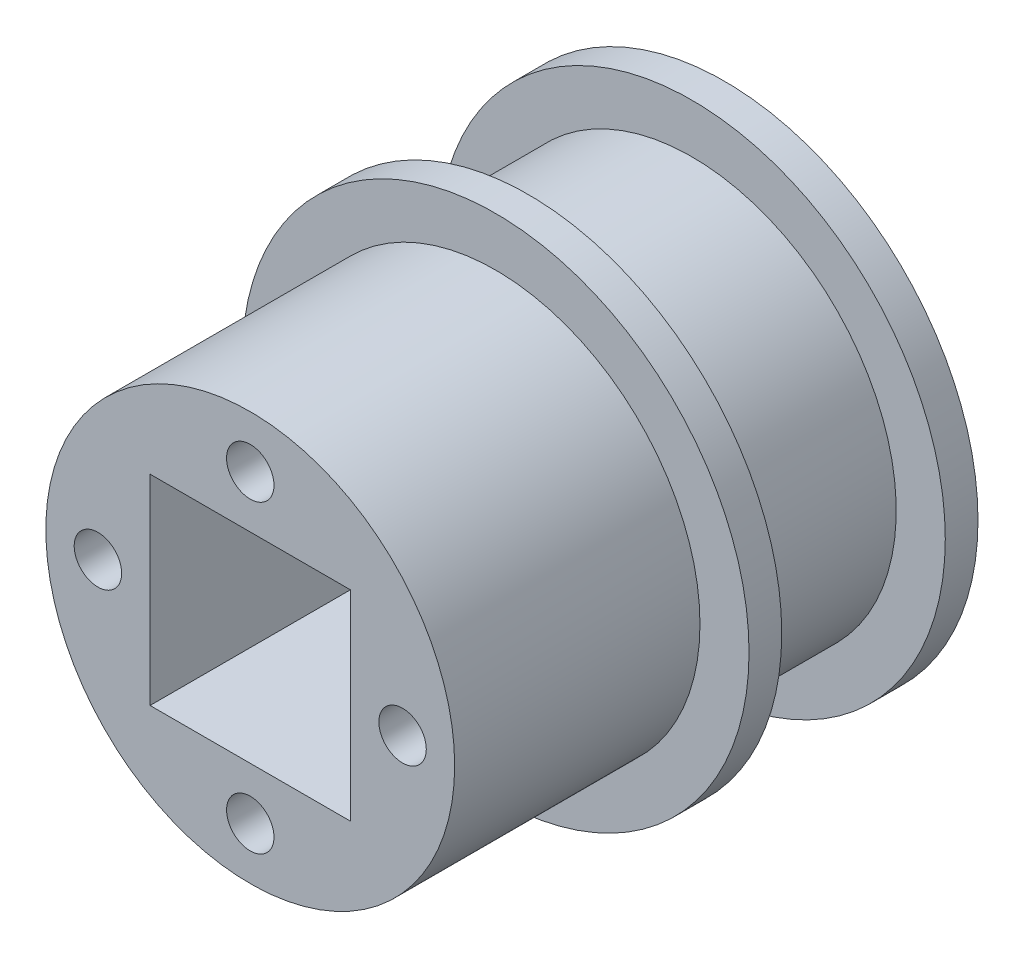
ISO-10303-21;
HEADER;
FILE_DESCRIPTION(('STEP AP214'),'2;1');
FILE_NAME('part.step','',(''),(''),'','','');
FILE_SCHEMA(('AUTOMOTIVE_DESIGN { 1 0 10303 214 1 1 1 1 }'));
ENDSEC;
DATA;
#1=APPLICATION_CONTEXT('core data for automotive mechanical design processes');
#2=APPLICATION_PROTOCOL_DEFINITION('international standard','automotive_design',2000,#1);
#3=PRODUCT_CONTEXT('',#1,'mechanical');
#4=PRODUCT('Part','Part','',(#3));
#5=PRODUCT_RELATED_PRODUCT_CATEGORY('part','',(#4));
#6=PRODUCT_DEFINITION_FORMATION('','',#4);
#7=PRODUCT_DEFINITION_CONTEXT('part definition',#1,'design');
#8=PRODUCT_DEFINITION('design','',#6,#7);
#9=PRODUCT_DEFINITION_SHAPE('','',#8);
#10=(LENGTH_UNIT() NAMED_UNIT(*) SI_UNIT(.MILLI.,.METRE.));
#11=(NAMED_UNIT(*) PLANE_ANGLE_UNIT() SI_UNIT($,.RADIAN.));
#12=(NAMED_UNIT(*) SI_UNIT($,.STERADIAN.) SOLID_ANGLE_UNIT());
#13=UNCERTAINTY_MEASURE_WITH_UNIT(LENGTH_MEASURE(1.E-05),#10,'distance_accuracy_value','');
#14=(GEOMETRIC_REPRESENTATION_CONTEXT(3) GLOBAL_UNCERTAINTY_ASSIGNED_CONTEXT((#13)) GLOBAL_UNIT_ASSIGNED_CONTEXT((#10,
#11,#12)) REPRESENTATION_CONTEXT('',''));
#15=CARTESIAN_POINT('',(0.,0.,0.));
#16=DIRECTION('',(0.,0.,1.));
#17=DIRECTION('',(1.,0.,0.));
#18=AXIS2_PLACEMENT_3D('',#15,#16,#17);
#19=CARTESIAN_POINT('',(0.,0.,7.5));
#20=DIRECTION('',(0.,0.,-1.));
#21=DIRECTION('',(-1.,0.,0.));
#22=AXIS2_PLACEMENT_3D('',#19,#20,#21);
#23=CYLINDRICAL_SURFACE('',#22,12.5);
#24=CARTESIAN_POINT('',(0.,0.,7.5));
#25=DIRECTION('',(0.,0.,1.));
#26=DIRECTION('',(1.,0.,0.));
#27=AXIS2_PLACEMENT_3D('',#24,#25,#26);
#28=CIRCLE('',#27,12.5);
#29=CARTESIAN_POINT('',(12.5,0.,7.5));
#30=VERTEX_POINT('',#29);
#31=EDGE_CURVE('E48',#30,#30,#28,.T.);
#32=ORIENTED_EDGE('',*,*,#31,.F.);
#33=EDGE_LOOP('',(#32));
#34=FACE_BOUND('',#33,.T.);
#35=CARTESIAN_POINT('',(0.,0.,-7.5));
#36=DIRECTION('',(0.,0.,1.));
#37=DIRECTION('',(1.,0.,0.));
#38=AXIS2_PLACEMENT_3D('',#35,#36,#37);
#39=CIRCLE('',#38,12.5);
#40=CARTESIAN_POINT('',(12.5,0.,-7.5));
#41=VERTEX_POINT('',#40);
#42=EDGE_CURVE('E42',#41,#41,#39,.T.);
#43=ORIENTED_EDGE('',*,*,#42,.T.);
#44=EDGE_LOOP('',(#43));
#45=FACE_BOUND('',#44,.T.);
#46=ADVANCED_FACE('F39',(#34,#45),#23,.T.);
#47=CARTESIAN_POINT('',(0.,0.,7.5));
#48=DIRECTION('',(0.,0.,1.));
#49=DIRECTION('',(1.,0.,0.));
#50=AXIS2_PLACEMENT_3D('',#47,#48,#49);
#51=PLANE('',#50);
#52=CARTESIAN_POINT('',(9.315,0.,7.5));
#53=DIRECTION('',(0.,0.,1.));
#54=DIRECTION('',(1.,0.,0.));
#55=AXIS2_PLACEMENT_3D('',#52,#53,#54);
#56=CIRCLE('',#55,1.45);
#57=CARTESIAN_POINT('',(10.765,0.,7.5));
#58=VERTEX_POINT('',#57);
#59=EDGE_CURVE('E333',#58,#58,#56,.T.);
#60=ORIENTED_EDGE('',*,*,#59,.F.);
#61=EDGE_LOOP('',(#60));
#62=FACE_BOUND('',#61,.T.);
#63=CARTESIAN_POINT('',(0.,-9.315,7.5));
#64=DIRECTION('',(0.,0.,1.));
#65=DIRECTION('',(1.,0.,0.));
#66=AXIS2_PLACEMENT_3D('',#63,#64,#65);
#67=CIRCLE('',#66,1.45);
#68=CARTESIAN_POINT('',(1.44999999999997,-9.315,7.5));
#69=VERTEX_POINT('',#68);
#70=EDGE_CURVE('E359',#69,#69,#67,.T.);
#71=ORIENTED_EDGE('',*,*,#70,.F.);
#72=EDGE_LOOP('',(#71));
#73=FACE_BOUND('',#72,.T.);
#74=CARTESIAN_POINT('',(-9.315,0.,7.5));
#75=DIRECTION('',(0.,0.,1.));
#76=DIRECTION('',(1.,0.,0.));
#77=AXIS2_PLACEMENT_3D('',#74,#75,#76);
#78=CIRCLE('',#77,1.45);
#79=CARTESIAN_POINT('',(-7.865,0.,7.5));
#80=VERTEX_POINT('',#79);
#81=EDGE_CURVE('E351',#80,#80,#78,.T.);
#82=ORIENTED_EDGE('',*,*,#81,.F.);
#83=EDGE_LOOP('',(#82));
#84=FACE_BOUND('',#83,.T.);
#85=CARTESIAN_POINT('',(0.,9.315,7.5));
#86=DIRECTION('',(0.,0.,1.));
#87=DIRECTION('',(1.,0.,0.));
#88=AXIS2_PLACEMENT_3D('',#85,#86,#87);
#89=CIRCLE('',#88,1.45);
#90=CARTESIAN_POINT('',(1.4500000000001,9.315,7.5));
#91=VERTEX_POINT('',#90);
#92=EDGE_CURVE('E343',#91,#91,#89,.T.);
#93=ORIENTED_EDGE('',*,*,#92,.F.);
#94=EDGE_LOOP('',(#93));
#95=FACE_BOUND('',#94,.T.);
#96=DIRECTION('',(0.,1.,0.));
#97=VECTOR('',#96,1.);
#98=CARTESIAN_POINT('',(6.125,6.125,7.5));
#99=LINE('',#98,#97);
#100=CARTESIAN_POINT('',(6.125,-6.125,7.5));
#101=VERTEX_POINT('',#100);
#102=CARTESIAN_POINT('',(6.125,6.125,7.5));
#103=VERTEX_POINT('',#102);
#104=EDGE_CURVE('E56',#101,#103,#99,.T.);
#105=ORIENTED_EDGE('',*,*,#104,.F.);
#106=DIRECTION('',(1.,0.,0.));
#107=VECTOR('',#106,1.);
#108=CARTESIAN_POINT('',(-6.125,-6.125,7.5));
#109=LINE('',#108,#107);
#110=CARTESIAN_POINT('',(-6.125,-6.125,7.5));
#111=VERTEX_POINT('',#110);
#112=EDGE_CURVE('E96',#111,#101,#109,.T.);
#113=ORIENTED_EDGE('',*,*,#112,.F.);
#114=DIRECTION('',(0.,-1.,0.));
#115=VECTOR('',#114,1.);
#116=CARTESIAN_POINT('',(-6.125,6.125,7.5));
#117=LINE('',#116,#115);
#118=CARTESIAN_POINT('',(-6.125,6.125,7.5));
#119=VERTEX_POINT('',#118);
#120=EDGE_CURVE('E114',#119,#111,#117,.T.);
#121=ORIENTED_EDGE('',*,*,#120,.F.);
#122=DIRECTION('',(-1.,0.,0.));
#123=VECTOR('',#122,1.);
#124=CARTESIAN_POINT('',(-6.125,6.125,7.5));
#125=LINE('',#124,#123);
#126=EDGE_CURVE('E106',#103,#119,#125,.T.);
#127=ORIENTED_EDGE('',*,*,#126,.F.);
#128=EDGE_LOOP('',(#105,#113,#121,#127));
#129=FACE_BOUND('',#128,.T.);
#130=ORIENTED_EDGE('',*,*,#31,.T.);
#131=EDGE_LOOP('',(#130));
#132=FACE_BOUND('',#131,.T.);
#133=ADVANCED_FACE('F165',(#62,#73,#84,#95,#129,#132),#51,.T.);
#134=CARTESIAN_POINT('',(0.,0.,-9.5));
#135=DIRECTION('',(0.,0.,1.));
#136=DIRECTION('',(1.,0.,0.));
#137=AXIS2_PLACEMENT_3D('',#134,#135,#136);
#138=CYLINDRICAL_SURFACE('',#137,15.5);
#139=CARTESIAN_POINT('',(0.,0.,-9.5));
#140=DIRECTION('',(0.,0.,-1.));
#141=DIRECTION('',(-1.,0.,0.));
#142=AXIS2_PLACEMENT_3D('',#139,#140,#141);
#143=CIRCLE('',#142,15.5);
#144=CARTESIAN_POINT('',(-15.5,0.,-9.5));
#145=VERTEX_POINT('',#144);
#146=EDGE_CURVE('E140',#145,#145,#143,.T.);
#147=ORIENTED_EDGE('',*,*,#146,.F.);
#148=EDGE_LOOP('',(#147));
#149=FACE_BOUND('',#148,.T.);
#150=CARTESIAN_POINT('',(0.,0.,-7.5));
#151=DIRECTION('',(0.,0.,-1.));
#152=DIRECTION('',(-1.,0.,0.));
#153=AXIS2_PLACEMENT_3D('',#150,#151,#152);
#154=CIRCLE('',#153,15.5);
#155=CARTESIAN_POINT('',(-15.5,0.,-7.5));
#156=VERTEX_POINT('',#155);
#157=EDGE_CURVE('E138',#156,#156,#154,.T.);
#158=ORIENTED_EDGE('',*,*,#157,.T.);
#159=EDGE_LOOP('',(#158));
#160=FACE_BOUND('',#159,.T.);
#161=ADVANCED_FACE('F163',(#149,#160),#138,.T.);
#162=CARTESIAN_POINT('',(0.,0.,-9.5));
#163=DIRECTION('',(0.,0.,-1.));
#164=DIRECTION('',(-1.,0.,0.));
#165=AXIS2_PLACEMENT_3D('',#162,#163,#164);
#166=PLANE('',#165);
#167=CARTESIAN_POINT('',(0.,0.,-9.5));
#168=DIRECTION('',(0.,0.,-1.));
#169=DIRECTION('',(-1.,0.,0.));
#170=AXIS2_PLACEMENT_3D('',#167,#168,#169);
#171=CIRCLE('',#170,12.5);
#172=CARTESIAN_POINT('',(-12.5,0.,-9.5));
#173=VERTEX_POINT('',#172);
#174=EDGE_CURVE('E11',#173,#173,#171,.T.);
#175=ORIENTED_EDGE('',*,*,#174,.F.);
#176=EDGE_LOOP('',(#175));
#177=FACE_BOUND('',#176,.T.);
#178=ORIENTED_EDGE('',*,*,#146,.T.);
#179=EDGE_LOOP('',(#178));
#180=FACE_BOUND('',#179,.T.);
#181=ADVANCED_FACE('F159',(#177,#180),#166,.T.);
#182=CARTESIAN_POINT('',(0.,0.,-7.5));
#183=DIRECTION('',(0.,0.,-1.));
#184=DIRECTION('',(-1.,0.,0.));
#185=AXIS2_PLACEMENT_3D('',#182,#183,#184);
#186=PLANE('',#185);
#187=ORIENTED_EDGE('',*,*,#42,.F.);
#188=EDGE_LOOP('',(#187));
#189=FACE_BOUND('',#188,.T.);
#190=ORIENTED_EDGE('',*,*,#157,.F.);
#191=EDGE_LOOP('',(#190));
#192=FACE_BOUND('',#191,.T.);
#193=ADVANCED_FACE('F155',(#189,#192),#186,.F.);
#194=CARTESIAN_POINT('',(0.,0.,-19.5));
#195=DIRECTION('',(0.,0.,1.));
#196=DIRECTION('',(1.,0.,0.));
#197=AXIS2_PLACEMENT_3D('',#194,#195,#196);
#198=CYLINDRICAL_SURFACE('',#197,12.5);
#199=CARTESIAN_POINT('',(0.,0.,-19.5));
#200=DIRECTION('',(0.,0.,-1.));
#201=DIRECTION('',(-1.,0.,0.));
#202=AXIS2_PLACEMENT_3D('',#199,#200,#201);
#203=CIRCLE('',#202,12.5);
#204=CARTESIAN_POINT('',(-12.5,0.,-19.5));
#205=VERTEX_POINT('',#204);
#206=EDGE_CURVE('E132',#205,#205,#203,.T.);
#207=ORIENTED_EDGE('',*,*,#206,.F.);
#208=EDGE_LOOP('',(#207));
#209=FACE_BOUND('',#208,.T.);
#210=ORIENTED_EDGE('',*,*,#174,.T.);
#211=EDGE_LOOP('',(#210));
#212=FACE_BOUND('',#211,.T.);
#213=ADVANCED_FACE('F158',(#209,#212),#198,.T.);
#214=CARTESIAN_POINT('',(0.,0.,-21.5));
#215=DIRECTION('',(0.,0.,1.));
#216=DIRECTION('',(1.,0.,0.));
#217=AXIS2_PLACEMENT_3D('',#214,#215,#216);
#218=CYLINDRICAL_SURFACE('',#217,15.5);
#219=CARTESIAN_POINT('',(0.,0.,-21.5));
#220=DIRECTION('',(0.,0.,-1.));
#221=DIRECTION('',(-1.,0.,0.));
#222=AXIS2_PLACEMENT_3D('',#219,#220,#221);
#223=CIRCLE('',#222,15.5);
#224=CARTESIAN_POINT('',(-15.5,0.,-21.5));
#225=VERTEX_POINT('',#224);
#226=EDGE_CURVE('E128',#225,#225,#223,.T.);
#227=ORIENTED_EDGE('',*,*,#226,.F.);
#228=EDGE_LOOP('',(#227));
#229=FACE_BOUND('',#228,.T.);
#230=CARTESIAN_POINT('',(0.,0.,-19.5));
#231=DIRECTION('',(0.,0.,-1.));
#232=DIRECTION('',(-1.,0.,0.));
#233=AXIS2_PLACEMENT_3D('',#230,#231,#232);
#234=CIRCLE('',#233,15.5);
#235=CARTESIAN_POINT('',(-15.5,0.,-19.5));
#236=VERTEX_POINT('',#235);
#237=EDGE_CURVE('E89',#236,#236,#234,.T.);
#238=ORIENTED_EDGE('',*,*,#237,.T.);
#239=EDGE_LOOP('',(#238));
#240=FACE_BOUND('',#239,.T.);
#241=ADVANCED_FACE('F200',(#229,#240),#218,.T.);
#242=CARTESIAN_POINT('',(0.,0.,-21.5));
#243=DIRECTION('',(0.,0.,-1.));
#244=DIRECTION('',(-1.,0.,0.));
#245=AXIS2_PLACEMENT_3D('',#242,#243,#244);
#246=PLANE('',#245);
#247=CARTESIAN_POINT('',(9.315,0.,-21.5));
#248=DIRECTION('',(0.,0.,-1.));
#249=DIRECTION('',(-1.,0.,0.));
#250=AXIS2_PLACEMENT_3D('',#247,#248,#249);
#251=CIRCLE('',#250,1.45);
#252=CARTESIAN_POINT('',(7.865,0.,-21.5));
#253=VERTEX_POINT('',#252);
#254=EDGE_CURVE('E336',#253,#253,#251,.F.);
#255=ORIENTED_EDGE('',*,*,#254,.T.);
#256=EDGE_LOOP('',(#255));
#257=FACE_BOUND('',#256,.T.);
#258=CARTESIAN_POINT('',(0.,-9.315,-21.5));
#259=DIRECTION('',(0.,0.,-1.));
#260=DIRECTION('',(-1.,0.,0.));
#261=AXIS2_PLACEMENT_3D('',#258,#259,#260);
#262=CIRCLE('',#261,1.45);
#263=CARTESIAN_POINT('',(-1.45000000000003,-9.315,-21.5));
#264=VERTEX_POINT('',#263);
#265=EDGE_CURVE('E355',#264,#264,#262,.F.);
#266=ORIENTED_EDGE('',*,*,#265,.T.);
#267=EDGE_LOOP('',(#266));
#268=FACE_BOUND('',#267,.T.);
#269=CARTESIAN_POINT('',(-9.315,0.,-21.5));
#270=DIRECTION('',(0.,0.,-1.));
#271=DIRECTION('',(-1.,0.,0.));
#272=AXIS2_PLACEMENT_3D('',#269,#270,#271);
#273=CIRCLE('',#272,1.45);
#274=CARTESIAN_POINT('',(-10.765,0.,-21.5));
#275=VERTEX_POINT('',#274);
#276=EDGE_CURVE('E347',#275,#275,#273,.F.);
#277=ORIENTED_EDGE('',*,*,#276,.T.);
#278=EDGE_LOOP('',(#277));
#279=FACE_BOUND('',#278,.T.);
#280=CARTESIAN_POINT('',(0.,9.315,-21.5));
#281=DIRECTION('',(0.,0.,-1.));
#282=DIRECTION('',(-1.,0.,0.));
#283=AXIS2_PLACEMENT_3D('',#280,#281,#282);
#284=CIRCLE('',#283,1.45);
#285=CARTESIAN_POINT('',(-1.4499999999999,9.315,-21.5));
#286=VERTEX_POINT('',#285);
#287=EDGE_CURVE('E339',#286,#286,#284,.F.);
#288=ORIENTED_EDGE('',*,*,#287,.T.);
#289=EDGE_LOOP('',(#288));
#290=FACE_BOUND('',#289,.T.);
#291=DIRECTION('',(0.,1.,0.));
#292=VECTOR('',#291,1.);
#293=CARTESIAN_POINT('',(6.125,6.125,-21.5));
#294=LINE('',#293,#292);
#295=CARTESIAN_POINT('',(6.125,-6.125,-21.5));
#296=VERTEX_POINT('',#295);
#297=CARTESIAN_POINT('',(6.125,6.125,-21.5));
#298=VERTEX_POINT('',#297);
#299=EDGE_CURVE('E93',#296,#298,#294,.T.);
#300=ORIENTED_EDGE('',*,*,#299,.T.);
#301=DIRECTION('',(-1.,0.,0.));
#302=VECTOR('',#301,1.);
#303=CARTESIAN_POINT('',(-6.125,6.125,-21.5));
#304=LINE('',#303,#302);
#305=CARTESIAN_POINT('',(-6.125,6.125,-21.5));
#306=VERTEX_POINT('',#305);
#307=EDGE_CURVE('E81',#298,#306,#304,.T.);
#308=ORIENTED_EDGE('',*,*,#307,.T.);
#309=DIRECTION('',(0.,-1.,0.));
#310=VECTOR('',#309,1.);
#311=CARTESIAN_POINT('',(-6.125,6.125,-21.5));
#312=LINE('',#311,#310);
#313=CARTESIAN_POINT('',(-6.125,-6.125,-21.5));
#314=VERTEX_POINT('',#313);
#315=EDGE_CURVE('E108',#306,#314,#312,.T.);
#316=ORIENTED_EDGE('',*,*,#315,.T.);
#317=DIRECTION('',(1.,0.,0.));
#318=VECTOR('',#317,1.);
#319=CARTESIAN_POINT('',(-6.125,-6.125,-21.5));
#320=LINE('',#319,#318);
#321=EDGE_CURVE('E101',#314,#296,#320,.T.);
#322=ORIENTED_EDGE('',*,*,#321,.T.);
#323=EDGE_LOOP('',(#300,#308,#316,#322));
#324=FACE_BOUND('',#323,.T.);
#325=ORIENTED_EDGE('',*,*,#226,.T.);
#326=EDGE_LOOP('',(#325));
#327=FACE_BOUND('',#326,.T.);
#328=ADVANCED_FACE('F99',(#257,#268,#279,#290,#324,#327),#246,.T.);
#329=CARTESIAN_POINT('',(0.,0.,-19.5));
#330=DIRECTION('',(0.,0.,-1.));
#331=DIRECTION('',(-1.,0.,0.));
#332=AXIS2_PLACEMENT_3D('',#329,#330,#331);
#333=PLANE('',#332);
#334=ORIENTED_EDGE('',*,*,#206,.T.);
#335=EDGE_LOOP('',(#334));
#336=FACE_BOUND('',#335,.T.);
#337=ORIENTED_EDGE('',*,*,#237,.F.);
#338=EDGE_LOOP('',(#337));
#339=FACE_BOUND('',#338,.T.);
#340=ADVANCED_FACE('F199',(#336,#339),#333,.F.);
#341=CARTESIAN_POINT('',(6.125,6.125,-21.501));
#342=DIRECTION('',(1.,0.,0.));
#343=DIRECTION('',(0.,1.,0.));
#344=AXIS2_PLACEMENT_3D('',#341,#342,#343);
#345=PLANE('',#344);
#346=DIRECTION('',(0.,0.,1.));
#347=VECTOR('',#346,1.);
#348=CARTESIAN_POINT('',(6.125,-6.125,-21.501));
#349=LINE('',#348,#347);
#350=EDGE_CURVE('E90',#296,#101,#349,.T.);
#351=ORIENTED_EDGE('',*,*,#350,.T.);
#352=ORIENTED_EDGE('',*,*,#104,.T.);
#353=DIRECTION('',(0.,0.,1.));
#354=VECTOR('',#353,1.);
#355=CARTESIAN_POINT('',(6.125,6.125,-21.501));
#356=LINE('',#355,#354);
#357=EDGE_CURVE('E83',#298,#103,#356,.T.);
#358=ORIENTED_EDGE('',*,*,#357,.F.);
#359=ORIENTED_EDGE('',*,*,#299,.F.);
#360=EDGE_LOOP('',(#351,#352,#358,#359));
#361=FACE_BOUND('',#360,.T.);
#362=ADVANCED_FACE('F92',(#361),#345,.F.);
#363=CARTESIAN_POINT('',(-6.125,-6.125,-21.501));
#364=DIRECTION('',(0.,-1.,0.));
#365=DIRECTION('',(0.,0.,-1.));
#366=AXIS2_PLACEMENT_3D('',#363,#364,#365);
#367=PLANE('',#366);
#368=DIRECTION('',(0.,0.,1.));
#369=VECTOR('',#368,1.);
#370=CARTESIAN_POINT('',(-6.125,-6.125,-21.501));
#371=LINE('',#370,#369);
#372=EDGE_CURVE('E123',#314,#111,#371,.T.);
#373=ORIENTED_EDGE('',*,*,#372,.T.);
#374=ORIENTED_EDGE('',*,*,#112,.T.);
#375=ORIENTED_EDGE('',*,*,#350,.F.);
#376=ORIENTED_EDGE('',*,*,#321,.F.);
#377=EDGE_LOOP('',(#373,#374,#375,#376));
#378=FACE_BOUND('',#377,.T.);
#379=ADVANCED_FACE('F252',(#378),#367,.F.);
#380=CARTESIAN_POINT('',(-6.125,6.125,-21.501));
#381=DIRECTION('',(-1.,0.,0.));
#382=DIRECTION('',(0.,-1.,0.));
#383=AXIS2_PLACEMENT_3D('',#380,#381,#382);
#384=PLANE('',#383);
#385=DIRECTION('',(0.,0.,1.));
#386=VECTOR('',#385,1.);
#387=CARTESIAN_POINT('',(-6.125,6.125,-21.501));
#388=LINE('',#387,#386);
#389=EDGE_CURVE('E64',#306,#119,#388,.T.);
#390=ORIENTED_EDGE('',*,*,#389,.T.);
#391=ORIENTED_EDGE('',*,*,#120,.T.);
#392=ORIENTED_EDGE('',*,*,#372,.F.);
#393=ORIENTED_EDGE('',*,*,#315,.F.);
#394=EDGE_LOOP('',(#390,#391,#392,#393));
#395=FACE_BOUND('',#394,.T.);
#396=ADVANCED_FACE('F255',(#395),#384,.F.);
#397=CARTESIAN_POINT('',(-6.125,6.125,-21.501));
#398=DIRECTION('',(0.,1.,0.));
#399=DIRECTION('',(0.,0.,1.));
#400=AXIS2_PLACEMENT_3D('',#397,#398,#399);
#401=PLANE('',#400);
#402=ORIENTED_EDGE('',*,*,#357,.T.);
#403=ORIENTED_EDGE('',*,*,#126,.T.);
#404=ORIENTED_EDGE('',*,*,#389,.F.);
#405=ORIENTED_EDGE('',*,*,#307,.F.);
#406=EDGE_LOOP('',(#402,#403,#404,#405));
#407=FACE_BOUND('',#406,.T.);
#408=ADVANCED_FACE('F82',(#407),#401,.F.);
#409=CARTESIAN_POINT('',(0.,9.315,-21.501));
#410=DIRECTION('',(0.,0.,1.));
#411=DIRECTION('',(1.,0.,0.));
#412=AXIS2_PLACEMENT_3D('',#409,#410,#411);
#413=CYLINDRICAL_SURFACE('',#412,1.45);
#414=ORIENTED_EDGE('',*,*,#287,.F.);
#415=EDGE_LOOP('',(#414));
#416=FACE_BOUND('',#415,.T.);
#417=ORIENTED_EDGE('',*,*,#92,.T.);
#418=EDGE_LOOP('',(#417));
#419=FACE_BOUND('',#418,.T.);
#420=ADVANCED_FACE('F210',(#416,#419),#413,.F.);
#421=CARTESIAN_POINT('',(-9.315,0.,-21.501));
#422=DIRECTION('',(0.,0.,1.));
#423=DIRECTION('',(1.,0.,0.));
#424=AXIS2_PLACEMENT_3D('',#421,#422,#423);
#425=CYLINDRICAL_SURFACE('',#424,1.45);
#426=ORIENTED_EDGE('',*,*,#276,.F.);
#427=EDGE_LOOP('',(#426));
#428=FACE_BOUND('',#427,.T.);
#429=ORIENTED_EDGE('',*,*,#81,.T.);
#430=EDGE_LOOP('',(#429));
#431=FACE_BOUND('',#430,.T.);
#432=ADVANCED_FACE('F215',(#428,#431),#425,.F.);
#433=CARTESIAN_POINT('',(0.,-9.315,-21.501));
#434=DIRECTION('',(0.,0.,1.));
#435=DIRECTION('',(1.,0.,0.));
#436=AXIS2_PLACEMENT_3D('',#433,#434,#435);
#437=CYLINDRICAL_SURFACE('',#436,1.45);
#438=ORIENTED_EDGE('',*,*,#265,.F.);
#439=EDGE_LOOP('',(#438));
#440=FACE_BOUND('',#439,.T.);
#441=ORIENTED_EDGE('',*,*,#70,.T.);
#442=EDGE_LOOP('',(#441));
#443=FACE_BOUND('',#442,.T.);
#444=ADVANCED_FACE('F225',(#440,#443),#437,.F.);
#445=CARTESIAN_POINT('',(9.315,0.,-21.501));
#446=DIRECTION('',(0.,0.,1.));
#447=DIRECTION('',(1.,0.,0.));
#448=AXIS2_PLACEMENT_3D('',#445,#446,#447);
#449=CYLINDRICAL_SURFACE('',#448,1.45);
#450=ORIENTED_EDGE('',*,*,#254,.F.);
#451=EDGE_LOOP('',(#450));
#452=FACE_BOUND('',#451,.T.);
#453=ORIENTED_EDGE('',*,*,#59,.T.);
#454=EDGE_LOOP('',(#453));
#455=FACE_BOUND('',#454,.T.);
#456=ADVANCED_FACE('F235',(#452,#455),#449,.F.);
#457=CLOSED_SHELL('',(#46,#133,#161,#181,#193,#213,#241,#328,#340,#362,#379,#396,#408,#420,#432,
#444,#456));
#458=MANIFOLD_SOLID_BREP('B2',#457);
#459=ADVANCED_BREP_SHAPE_REPRESENTATION('',(#18,#458),#14);
#460=SHAPE_DEFINITION_REPRESENTATION(#9,#459);
ENDSEC;
END-ISO-10303-21;
